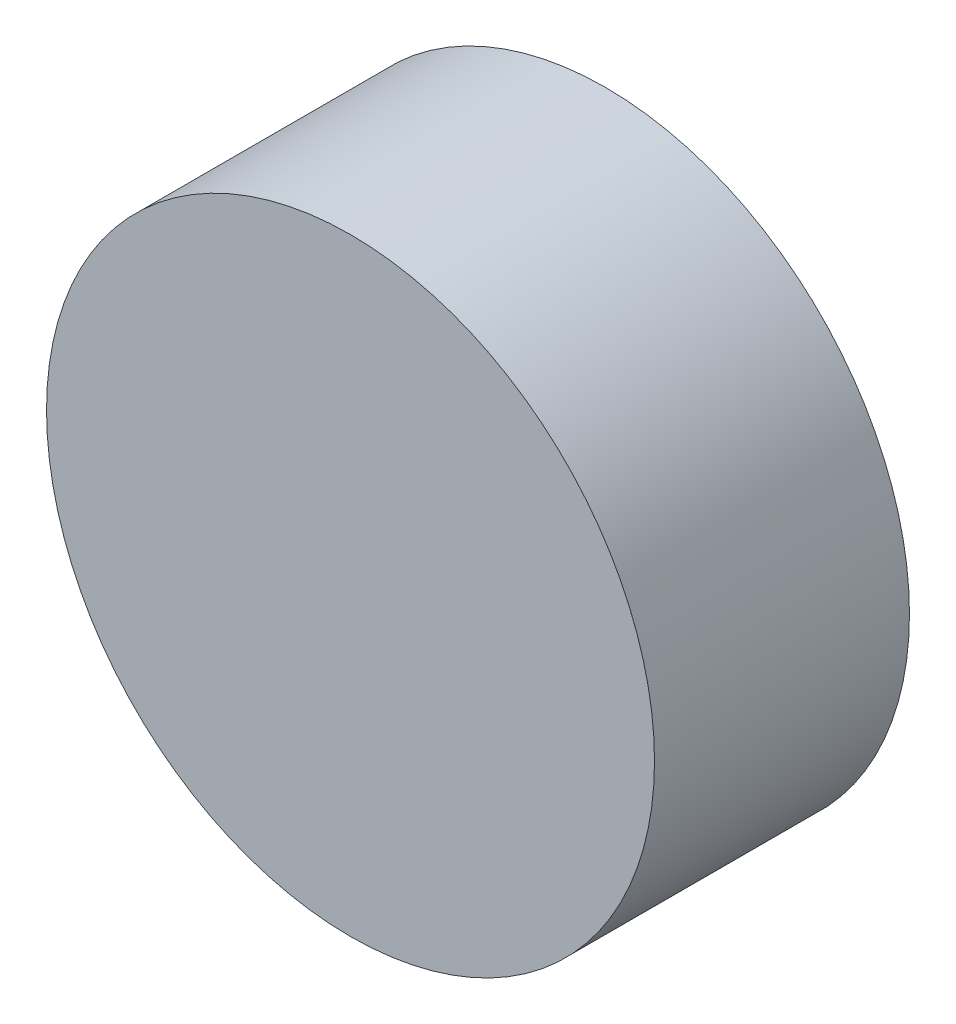
ISO-10303-21;
HEADER;
FILE_DESCRIPTION(('STEP AP214'),'2;1');
FILE_NAME('part.step','',(''),(''),'','','');
FILE_SCHEMA(('AUTOMOTIVE_DESIGN { 1 0 10303 214 1 1 1 1 }'));
ENDSEC;
DATA;
#1=APPLICATION_CONTEXT('core data for automotive mechanical design processes');
#2=APPLICATION_PROTOCOL_DEFINITION('international standard','automotive_design',2000,#1);
#3=PRODUCT_CONTEXT('',#1,'mechanical');
#4=PRODUCT('Part','Part','',(#3));
#5=PRODUCT_RELATED_PRODUCT_CATEGORY('part','',(#4));
#6=PRODUCT_DEFINITION_FORMATION('','',#4);
#7=PRODUCT_DEFINITION_CONTEXT('part definition',#1,'design');
#8=PRODUCT_DEFINITION('design','',#6,#7);
#9=PRODUCT_DEFINITION_SHAPE('','',#8);
#10=(LENGTH_UNIT() NAMED_UNIT(*) SI_UNIT(.MILLI.,.METRE.));
#11=(NAMED_UNIT(*) PLANE_ANGLE_UNIT() SI_UNIT($,.RADIAN.));
#12=(NAMED_UNIT(*) SI_UNIT($,.STERADIAN.) SOLID_ANGLE_UNIT());
#13=UNCERTAINTY_MEASURE_WITH_UNIT(LENGTH_MEASURE(1.E-05),#10,'distance_accuracy_value','');
#14=(GEOMETRIC_REPRESENTATION_CONTEXT(3) GLOBAL_UNCERTAINTY_ASSIGNED_CONTEXT((#13)) GLOBAL_UNIT_ASSIGNED_CONTEXT((#10,
#11,#12)) REPRESENTATION_CONTEXT('',''));
#15=CARTESIAN_POINT('',(0.,0.,0.));
#16=DIRECTION('',(0.,0.,1.));
#17=DIRECTION('',(1.,0.,0.));
#18=AXIS2_PLACEMENT_3D('',#15,#16,#17);
#19=CARTESIAN_POINT('',(0.,0.,26.));
#20=DIRECTION('',(0.,0.,-1.));
#21=DIRECTION('',(-1.,0.,0.));
#22=AXIS2_PLACEMENT_3D('',#19,#20,#21);
#23=CYLINDRICAL_SURFACE('',#22,31.);
#24=CARTESIAN_POINT('',(0.,0.,26.));
#25=DIRECTION('',(0.,0.,1.));
#26=DIRECTION('',(1.,0.,0.));
#27=AXIS2_PLACEMENT_3D('',#24,#25,#26);
#28=CIRCLE('',#27,31.);
#29=CARTESIAN_POINT('',(-31.,0.,26.));
#30=VERTEX_POINT('',#29);
#31=EDGE_CURVE('E10',#30,#30,#28,.T.);
#32=CARTESIAN_POINT('',(0.,0.,0.));
#33=DIRECTION('',(0.,0.,1.));
#34=DIRECTION('',(1.,0.,0.));
#35=AXIS2_PLACEMENT_3D('',#32,#33,#34);
#36=CIRCLE('',#35,31.);
#37=CARTESIAN_POINT('',(-31.,0.,0.));
#38=VERTEX_POINT('',#37);
#39=EDGE_CURVE('E42',#38,#38,#36,.T.);
#40=CARTESIAN_POINT('',(-31.,0.,26.));
#41=CARTESIAN_POINT('',(-31.,0.,25.7291666666667));
#42=CARTESIAN_POINT('',(-31.,0.,25.4583333333333));
#43=CARTESIAN_POINT('',(-31.,0.,24.9166666666667));
#44=CARTESIAN_POINT('',(-31.,0.,24.6458333333333));
#45=CARTESIAN_POINT('',(-31.,0.,24.1041666666667));
#46=CARTESIAN_POINT('',(-31.,0.,23.8333333333333));
#47=CARTESIAN_POINT('',(-31.,0.,23.2916666666667));
#48=CARTESIAN_POINT('',(-31.,0.,23.0208333333333));
#49=CARTESIAN_POINT('',(-31.,0.,22.4791666666667));
#50=CARTESIAN_POINT('',(-31.,0.,22.2083333333333));
#51=CARTESIAN_POINT('',(-31.,0.,21.6666666666667));
#52=CARTESIAN_POINT('',(-31.,0.,21.3958333333333));
#53=CARTESIAN_POINT('',(-31.,0.,20.8541666666667));
#54=CARTESIAN_POINT('',(-31.,0.,20.5833333333333));
#55=CARTESIAN_POINT('',(-31.,0.,20.0416666666667));
#56=CARTESIAN_POINT('',(-31.,0.,19.7708333333333));
#57=CARTESIAN_POINT('',(-31.,0.,19.2291666666667));
#58=CARTESIAN_POINT('',(-31.,0.,18.9583333333333));
#59=CARTESIAN_POINT('',(-31.,0.,18.4166666666667));
#60=CARTESIAN_POINT('',(-31.,0.,18.1458333333333));
#61=CARTESIAN_POINT('',(-31.,0.,17.6041666666667));
#62=CARTESIAN_POINT('',(-31.,0.,17.3333333333333));
#63=CARTESIAN_POINT('',(-31.,0.,16.7916666666667));
#64=CARTESIAN_POINT('',(-31.,0.,16.5208333333333));
#65=CARTESIAN_POINT('',(-31.,0.,15.9791666666667));
#66=CARTESIAN_POINT('',(-31.,0.,15.7083333333333));
#67=CARTESIAN_POINT('',(-31.,0.,15.1666666666667));
#68=CARTESIAN_POINT('',(-31.,0.,14.8958333333333));
#69=CARTESIAN_POINT('',(-31.,0.,14.3541666666667));
#70=CARTESIAN_POINT('',(-31.,0.,14.0833333333333));
#71=CARTESIAN_POINT('',(-31.,0.,13.5416666666667));
#72=CARTESIAN_POINT('',(-31.,0.,13.2708333333333));
#73=CARTESIAN_POINT('',(-31.,0.,12.7291666666667));
#74=CARTESIAN_POINT('',(-31.,0.,12.4583333333333));
#75=CARTESIAN_POINT('',(-31.,0.,11.9166666666667));
#76=CARTESIAN_POINT('',(-31.,0.,11.6458333333333));
#77=CARTESIAN_POINT('',(-31.,0.,11.1041666666667));
#78=CARTESIAN_POINT('',(-31.,0.,10.8333333333333));
#79=CARTESIAN_POINT('',(-31.,0.,10.2916666666667));
#80=CARTESIAN_POINT('',(-31.,0.,10.0208333333333));
#81=CARTESIAN_POINT('',(-31.,0.,9.47916666666667));
#82=CARTESIAN_POINT('',(-31.,0.,9.20833333333333));
#83=CARTESIAN_POINT('',(-31.,0.,8.66666666666667));
#84=CARTESIAN_POINT('',(-31.,0.,8.39583333333333));
#85=CARTESIAN_POINT('',(-31.,0.,7.85416666666667));
#86=CARTESIAN_POINT('',(-31.,0.,7.58333333333333));
#87=CARTESIAN_POINT('',(-31.,0.,7.04166666666667));
#88=CARTESIAN_POINT('',(-31.,0.,6.77083333333333));
#89=CARTESIAN_POINT('',(-31.,0.,6.22916666666667));
#90=CARTESIAN_POINT('',(-31.,0.,5.95833333333333));
#91=CARTESIAN_POINT('',(-31.,0.,5.41666666666667));
#92=CARTESIAN_POINT('',(-31.,0.,5.14583333333333));
#93=CARTESIAN_POINT('',(-31.,0.,4.60416666666667));
#94=CARTESIAN_POINT('',(-31.,0.,4.33333333333333));
#95=CARTESIAN_POINT('',(-31.,0.,3.79166666666667));
#96=CARTESIAN_POINT('',(-31.,0.,3.52083333333333));
#97=CARTESIAN_POINT('',(-31.,0.,2.97916666666667));
#98=CARTESIAN_POINT('',(-31.,0.,2.70833333333333));
#99=CARTESIAN_POINT('',(-31.,0.,2.16666666666667));
#100=CARTESIAN_POINT('',(-31.,0.,1.89583333333333));
#101=CARTESIAN_POINT('',(-31.,0.,1.35416666666667));
#102=CARTESIAN_POINT('',(-31.,0.,1.08333333333333));
#103=CARTESIAN_POINT('',(-31.,0.,0.541666666666667));
#104=CARTESIAN_POINT('',(-31.,0.,0.270833333333334));
#105=CARTESIAN_POINT('',(-31.,0.,0.));
#106=B_SPLINE_CURVE_WITH_KNOTS('',3,(#40,#41,#42,#43,#44,#45,#46,#47,#48,#49,#50,#51,#52,#53,
#54,#55,#56,#57,#58,#59,#60,#61,#62,#63,#64,#65,#66,#67,#68,#69,#70,#71,#72,#73,#74,#75,#76,#77,
#78,#79,#80,#81,#82,#83,#84,#85,#86,#87,#88,#89,#90,#91,#92,#93,#94,#95,#96,#97,#98,#99,#100,
#101,#102,#103,#104,#105),.UNSPECIFIED.,.F.,.F.,(4,2,2,2,2,2,2,2,2,2,2,2,2,2,2,2,2,2,2,2,2,2,2,
2,2,2,2,2,2,2,2,2,4),(0.,0.812499999999997,1.625,2.4375,3.25,4.0625,4.875,5.6875,6.5,7.3125,
8.125,8.93749999999999,9.74999999999999,10.5625,11.375,12.1875,13.,13.8125,14.625,15.4375,16.25,
17.0625,17.875,18.6875,19.5,20.3125,21.125,21.9375,22.75,23.5625,24.375,25.1875,26.),.UNSPECIFIED.);
#107=EDGE_CURVE('BSEAM39',#30,#38,#106,.T.);
#108=ORIENTED_EDGE('',*,*,#31,.F.);
#109=ORIENTED_EDGE('',*,*,#39,.T.);
#110=ORIENTED_EDGE('',*,*,#107,.T.);
#111=ORIENTED_EDGE('',*,*,#107,.F.);
#112=EDGE_LOOP('',(#108,#110,#109,#111));
#113=FACE_BOUND('',#112,.T.);
#114=ADVANCED_FACE('F39',(#113),#23,.T.);
#115=CARTESIAN_POINT('',(0.,0.,26.));
#116=DIRECTION('',(0.,0.,1.));
#117=DIRECTION('',(1.,0.,0.));
#118=AXIS2_PLACEMENT_3D('',#115,#116,#117);
#119=PLANE('',#118);
#120=ORIENTED_EDGE('',*,*,#31,.T.);
#121=EDGE_LOOP('',(#120));
#122=FACE_BOUND('',#121,.T.);
#123=ADVANCED_FACE('F56',(#122),#119,.T.);
#124=CARTESIAN_POINT('',(0.,0.,0.));
#125=DIRECTION('',(0.,0.,1.));
#126=DIRECTION('',(1.,0.,0.));
#127=AXIS2_PLACEMENT_3D('',#124,#125,#126);
#128=PLANE('',#127);
#129=ORIENTED_EDGE('',*,*,#39,.F.);
#130=EDGE_LOOP('',(#129));
#131=FACE_BOUND('',#130,.T.);
#132=ADVANCED_FACE('F54',(#131),#128,.F.);
#133=CLOSED_SHELL('',(#114,#123,#132));
#134=MANIFOLD_SOLID_BREP('B2',#133);
#135=ADVANCED_BREP_SHAPE_REPRESENTATION('',(#18,#134),#14);
#136=SHAPE_DEFINITION_REPRESENTATION(#9,#135);
ENDSEC;
END-ISO-10303-21;
